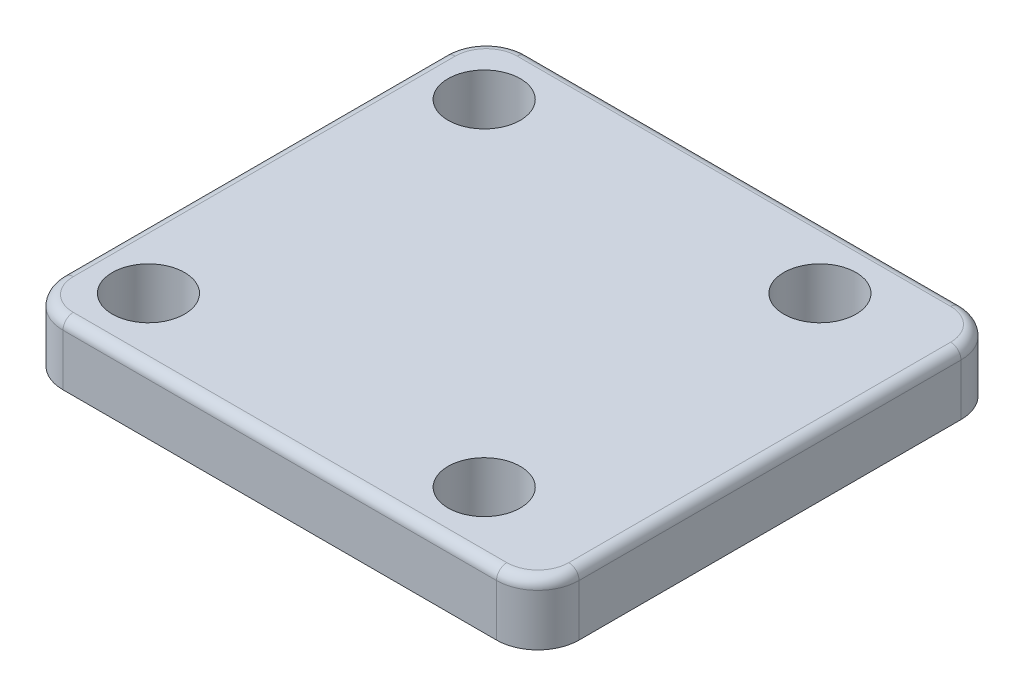
ISO-10303-21;
HEADER;
FILE_DESCRIPTION(('STEP AP214'),'2;1');
FILE_NAME('part.step','',(''),(''),'','','');
FILE_SCHEMA(('AUTOMOTIVE_DESIGN { 1 0 10303 214 1 1 1 1 }'));
ENDSEC;
DATA;
#1=APPLICATION_CONTEXT('core data for automotive mechanical design processes');
#2=APPLICATION_PROTOCOL_DEFINITION('international standard','automotive_design',2000,#1);
#3=PRODUCT_CONTEXT('',#1,'mechanical');
#4=PRODUCT('Part','Part','',(#3));
#5=PRODUCT_RELATED_PRODUCT_CATEGORY('part','',(#4));
#6=PRODUCT_DEFINITION_FORMATION('','',#4);
#7=PRODUCT_DEFINITION_CONTEXT('part definition',#1,'design');
#8=PRODUCT_DEFINITION('design','',#6,#7);
#9=PRODUCT_DEFINITION_SHAPE('','',#8);
#10=(LENGTH_UNIT() NAMED_UNIT(*) SI_UNIT(.MILLI.,.METRE.));
#11=(NAMED_UNIT(*) PLANE_ANGLE_UNIT() SI_UNIT($,.RADIAN.));
#12=(NAMED_UNIT(*) SI_UNIT($,.STERADIAN.) SOLID_ANGLE_UNIT());
#13=UNCERTAINTY_MEASURE_WITH_UNIT(LENGTH_MEASURE(1.E-05),#10,'distance_accuracy_value','');
#14=(GEOMETRIC_REPRESENTATION_CONTEXT(3) GLOBAL_UNCERTAINTY_ASSIGNED_CONTEXT((#13)) GLOBAL_UNIT_ASSIGNED_CONTEXT((#10,
#11,#12)) REPRESENTATION_CONTEXT('',''));
#15=CARTESIAN_POINT('',(0.,0.,0.));
#16=DIRECTION('',(0.,0.,1.));
#17=DIRECTION('',(1.,0.,0.));
#18=AXIS2_PLACEMENT_3D('',#15,#16,#17);
#19=CARTESIAN_POINT('',(23.6943462897526,6.,-18.5));
#20=DIRECTION('',(0.,-1.,0.));
#21=DIRECTION('',(0.,0.,-1.));
#22=AXIS2_PLACEMENT_3D('',#19,#20,#21);
#23=CYLINDRICAL_SURFACE('',#22,4.);
#24=DIRECTION('',(0.,-1.,0.));
#25=VECTOR('',#24,1.);
#26=CARTESIAN_POINT('',(23.6943462897526,6.,-22.5));
#27=LINE('',#26,#25);
#28=CARTESIAN_POINT('',(23.6943462897526,5.,-22.5));
#29=VERTEX_POINT('',#28);
#30=CARTESIAN_POINT('',(23.6943462897526,0.,-22.5));
#31=VERTEX_POINT('',#30);
#32=EDGE_CURVE('E138',#29,#31,#27,.T.);
#33=ORIENTED_EDGE('',*,*,#32,.F.);
#34=CARTESIAN_POINT('',(23.6943462897526,5.,-18.5));
#35=DIRECTION('',(0.,-1.,0.));
#36=DIRECTION('',(0.,0.,-1.));
#37=AXIS2_PLACEMENT_3D('',#34,#35,#36);
#38=CIRCLE('',#37,4.);
#39=CARTESIAN_POINT('',(27.6943462897526,5.,-18.5));
#40=VERTEX_POINT('',#39);
#41=EDGE_CURVE('E226',#29,#40,#38,.T.);
#42=ORIENTED_EDGE('',*,*,#41,.T.);
#43=DIRECTION('',(0.,-1.,0.));
#44=VECTOR('',#43,1.);
#45=CARTESIAN_POINT('',(27.6943462897526,6.,-18.5));
#46=LINE('',#45,#44);
#47=CARTESIAN_POINT('',(27.6943462897526,0.,-18.5));
#48=VERTEX_POINT('',#47);
#49=EDGE_CURVE('E159',#40,#48,#46,.T.);
#50=ORIENTED_EDGE('',*,*,#49,.T.);
#51=CARTESIAN_POINT('',(23.6943462897526,0.,-18.5));
#52=DIRECTION('',(0.,1.,0.));
#53=DIRECTION('',(0.,0.,-1.));
#54=AXIS2_PLACEMENT_3D('',#51,#52,#53);
#55=CIRCLE('',#54,4.);
#56=EDGE_CURVE('E153',#48,#31,#55,.T.);
#57=ORIENTED_EDGE('',*,*,#56,.T.);
#58=EDGE_LOOP('',(#33,#42,#50,#57));
#59=FACE_BOUND('',#58,.T.);
#60=ADVANCED_FACE('F47',(#59),#23,.T.);
#61=CARTESIAN_POINT('',(-18.3056537102473,6.,-22.5));
#62=DIRECTION('',(0.,0.,1.));
#63=DIRECTION('',(1.,0.,0.));
#64=AXIS2_PLACEMENT_3D('',#61,#62,#63);
#65=PLANE('',#64);
#66=DIRECTION('',(0.,-1.,0.));
#67=VECTOR('',#66,1.);
#68=CARTESIAN_POINT('',(-18.3056537102473,6.,-22.5));
#69=LINE('',#68,#67);
#70=CARTESIAN_POINT('',(-18.3056537102473,5.,-22.5));
#71=VERTEX_POINT('',#70);
#72=CARTESIAN_POINT('',(-18.3056537102473,0.,-22.5));
#73=VERTEX_POINT('',#72);
#74=EDGE_CURVE('E147',#71,#73,#69,.T.);
#75=ORIENTED_EDGE('',*,*,#74,.F.);
#76=DIRECTION('',(-1.,0.,0.));
#77=VECTOR('',#76,1.);
#78=CARTESIAN_POINT('',(-18.3056537102473,5.,-22.5));
#79=LINE('',#78,#77);
#80=EDGE_CURVE('E65',#71,#29,#79,.F.);
#81=ORIENTED_EDGE('',*,*,#80,.T.);
#82=ORIENTED_EDGE('',*,*,#32,.T.);
#83=DIRECTION('',(-1.,0.,0.));
#84=VECTOR('',#83,1.);
#85=CARTESIAN_POINT('',(-18.3056537102473,0.,-22.5));
#86=LINE('',#85,#84);
#87=EDGE_CURVE('E141',#31,#73,#86,.T.);
#88=ORIENTED_EDGE('',*,*,#87,.T.);
#89=EDGE_LOOP('',(#75,#81,#82,#88));
#90=FACE_BOUND('',#89,.T.);
#91=ADVANCED_FACE('F140',(#90),#65,.F.);
#92=CARTESIAN_POINT('',(-18.3056537102474,6.,-18.5));
#93=DIRECTION('',(0.,-1.,0.));
#94=DIRECTION('',(0.,0.,-1.));
#95=AXIS2_PLACEMENT_3D('',#92,#93,#94);
#96=CYLINDRICAL_SURFACE('',#95,4.);
#97=DIRECTION('',(0.,-1.,0.));
#98=VECTOR('',#97,1.);
#99=CARTESIAN_POINT('',(-22.3056537102474,6.,-18.5));
#100=LINE('',#99,#98);
#101=CARTESIAN_POINT('',(-22.3056537102474,5.,-18.5));
#102=VERTEX_POINT('',#101);
#103=CARTESIAN_POINT('',(-22.3056537102474,0.,-18.5));
#104=VERTEX_POINT('',#103);
#105=EDGE_CURVE('E194',#102,#104,#100,.T.);
#106=ORIENTED_EDGE('',*,*,#105,.F.);
#107=CARTESIAN_POINT('',(-18.3056537102474,5.,-18.5));
#108=DIRECTION('',(0.,-1.,0.));
#109=DIRECTION('',(0.,0.,-1.));
#110=AXIS2_PLACEMENT_3D('',#107,#108,#109);
#111=CIRCLE('',#110,4.);
#112=EDGE_CURVE('E73',#102,#71,#111,.T.);
#113=ORIENTED_EDGE('',*,*,#112,.T.);
#114=ORIENTED_EDGE('',*,*,#74,.T.);
#115=CARTESIAN_POINT('',(-18.3056537102474,0.,-18.5));
#116=DIRECTION('',(0.,1.,0.));
#117=DIRECTION('',(0.,0.,1.));
#118=AXIS2_PLACEMENT_3D('',#115,#116,#117);
#119=CIRCLE('',#118,4.);
#120=EDGE_CURVE('E156',#73,#104,#119,.T.);
#121=ORIENTED_EDGE('',*,*,#120,.T.);
#122=EDGE_LOOP('',(#106,#113,#114,#121));
#123=FACE_BOUND('',#122,.T.);
#124=ADVANCED_FACE('F298',(#123),#96,.T.);
#125=CARTESIAN_POINT('',(-22.3056537102474,6.,-18.5));
#126=DIRECTION('',(1.,0.,0.));
#127=DIRECTION('',(0.,0.,-1.));
#128=AXIS2_PLACEMENT_3D('',#125,#126,#127);
#129=PLANE('',#128);
#130=DIRECTION('',(0.,-1.,0.));
#131=VECTOR('',#130,1.);
#132=CARTESIAN_POINT('',(-22.3056537102474,6.,18.5));
#133=LINE('',#132,#131);
#134=CARTESIAN_POINT('',(-22.3056537102474,5.,18.5));
#135=VERTEX_POINT('',#134);
#136=CARTESIAN_POINT('',(-22.3056537102474,0.,18.5));
#137=VERTEX_POINT('',#136);
#138=EDGE_CURVE('E192',#135,#137,#133,.T.);
#139=ORIENTED_EDGE('',*,*,#138,.F.);
#140=DIRECTION('',(0.,0.,1.));
#141=VECTOR('',#140,1.);
#142=CARTESIAN_POINT('',(-22.3056537102474,5.,-18.5));
#143=LINE('',#142,#141);
#144=EDGE_CURVE('E222',#135,#102,#143,.F.);
#145=ORIENTED_EDGE('',*,*,#144,.T.);
#146=ORIENTED_EDGE('',*,*,#105,.T.);
#147=DIRECTION('',(0.,0.,1.));
#148=VECTOR('',#147,1.);
#149=CARTESIAN_POINT('',(-22.3056537102474,0.,-18.5));
#150=LINE('',#149,#148);
#151=EDGE_CURVE('E171',#104,#137,#150,.T.);
#152=ORIENTED_EDGE('',*,*,#151,.T.);
#153=EDGE_LOOP('',(#139,#145,#146,#152));
#154=FACE_BOUND('',#153,.T.);
#155=ADVANCED_FACE('F364',(#154),#129,.F.);
#156=CARTESIAN_POINT('',(-18.3056537102474,6.,18.5));
#157=DIRECTION('',(0.,-1.,0.));
#158=DIRECTION('',(0.,0.,-1.));
#159=AXIS2_PLACEMENT_3D('',#156,#157,#158);
#160=CYLINDRICAL_SURFACE('',#159,4.);
#161=DIRECTION('',(0.,-1.,0.));
#162=VECTOR('',#161,1.);
#163=CARTESIAN_POINT('',(-18.3056537102474,6.,22.5));
#164=LINE('',#163,#162);
#165=CARTESIAN_POINT('',(-18.3056537102474,5.,22.5));
#166=VERTEX_POINT('',#165);
#167=CARTESIAN_POINT('',(-18.3056537102474,0.,22.5));
#168=VERTEX_POINT('',#167);
#169=EDGE_CURVE('E190',#166,#168,#164,.T.);
#170=ORIENTED_EDGE('',*,*,#169,.F.);
#171=CARTESIAN_POINT('',(-18.3056537102474,5.,18.5));
#172=DIRECTION('',(0.,-1.,0.));
#173=DIRECTION('',(0.,0.,-1.));
#174=AXIS2_PLACEMENT_3D('',#171,#172,#173);
#175=CIRCLE('',#174,4.);
#176=EDGE_CURVE('E220',#166,#135,#175,.T.);
#177=ORIENTED_EDGE('',*,*,#176,.T.);
#178=ORIENTED_EDGE('',*,*,#138,.T.);
#179=CARTESIAN_POINT('',(-18.3056537102474,0.,18.5));
#180=DIRECTION('',(0.,1.,0.));
#181=DIRECTION('',(0.,0.,1.));
#182=AXIS2_PLACEMENT_3D('',#179,#180,#181);
#183=CIRCLE('',#182,4.);
#184=EDGE_CURVE('E174',#137,#168,#183,.T.);
#185=ORIENTED_EDGE('',*,*,#184,.T.);
#186=EDGE_LOOP('',(#170,#177,#178,#185));
#187=FACE_BOUND('',#186,.T.);
#188=ADVANCED_FACE('F362',(#187),#160,.T.);
#189=CARTESIAN_POINT('',(-18.3056537102473,6.,22.5));
#190=DIRECTION('',(0.,0.,-1.));
#191=DIRECTION('',(-1.,0.,0.));
#192=AXIS2_PLACEMENT_3D('',#189,#190,#191);
#193=PLANE('',#192);
#194=DIRECTION('',(0.,-1.,0.));
#195=VECTOR('',#194,1.);
#196=CARTESIAN_POINT('',(23.6943462897526,6.,22.5));
#197=LINE('',#196,#195);
#198=CARTESIAN_POINT('',(23.6943462897526,5.,22.5));
#199=VERTEX_POINT('',#198);
#200=CARTESIAN_POINT('',(23.6943462897526,0.,22.5));
#201=VERTEX_POINT('',#200);
#202=EDGE_CURVE('E188',#199,#201,#197,.T.);
#203=ORIENTED_EDGE('',*,*,#202,.F.);
#204=DIRECTION('',(1.,0.,0.));
#205=VECTOR('',#204,1.);
#206=CARTESIAN_POINT('',(-18.3056537102473,5.,22.5));
#207=LINE('',#206,#205);
#208=EDGE_CURVE('E218',#199,#166,#207,.F.);
#209=ORIENTED_EDGE('',*,*,#208,.T.);
#210=ORIENTED_EDGE('',*,*,#169,.T.);
#211=DIRECTION('',(1.,0.,0.));
#212=VECTOR('',#211,1.);
#213=CARTESIAN_POINT('',(-18.3056537102473,0.,22.5));
#214=LINE('',#213,#212);
#215=EDGE_CURVE('E177',#168,#201,#214,.T.);
#216=ORIENTED_EDGE('',*,*,#215,.T.);
#217=EDGE_LOOP('',(#203,#209,#210,#216));
#218=FACE_BOUND('',#217,.T.);
#219=ADVANCED_FACE('F352',(#218),#193,.F.);
#220=CARTESIAN_POINT('',(23.6943462897526,6.,18.5));
#221=DIRECTION('',(0.,-1.,0.));
#222=DIRECTION('',(0.,0.,-1.));
#223=AXIS2_PLACEMENT_3D('',#220,#221,#222);
#224=CYLINDRICAL_SURFACE('',#223,4.);
#225=DIRECTION('',(0.,-1.,0.));
#226=VECTOR('',#225,1.);
#227=CARTESIAN_POINT('',(27.6943462897526,6.,18.5));
#228=LINE('',#227,#226);
#229=CARTESIAN_POINT('',(27.6943462897526,5.,18.5));
#230=VERTEX_POINT('',#229);
#231=CARTESIAN_POINT('',(27.6943462897526,0.,18.5));
#232=VERTEX_POINT('',#231);
#233=EDGE_CURVE('E186',#230,#232,#228,.T.);
#234=ORIENTED_EDGE('',*,*,#233,.F.);
#235=CARTESIAN_POINT('',(23.6943462897526,5.,18.5));
#236=DIRECTION('',(0.,-1.,0.));
#237=DIRECTION('',(0.,0.,-1.));
#238=AXIS2_PLACEMENT_3D('',#235,#236,#237);
#239=CIRCLE('',#238,4.);
#240=EDGE_CURVE('E216',#230,#199,#239,.T.);
#241=ORIENTED_EDGE('',*,*,#240,.T.);
#242=ORIENTED_EDGE('',*,*,#202,.T.);
#243=CARTESIAN_POINT('',(23.6943462897526,0.,18.5));
#244=DIRECTION('',(0.,1.,0.));
#245=DIRECTION('',(0.,0.,1.));
#246=AXIS2_PLACEMENT_3D('',#243,#244,#245);
#247=CIRCLE('',#246,4.);
#248=EDGE_CURVE('E180',#201,#232,#247,.T.);
#249=ORIENTED_EDGE('',*,*,#248,.T.);
#250=EDGE_LOOP('',(#234,#241,#242,#249));
#251=FACE_BOUND('',#250,.T.);
#252=ADVANCED_FACE('F349',(#251),#224,.T.);
#253=CARTESIAN_POINT('',(27.6943462897526,6.,-18.5));
#254=DIRECTION('',(-1.,0.,0.));
#255=DIRECTION('',(0.,0.,1.));
#256=AXIS2_PLACEMENT_3D('',#253,#254,#255);
#257=PLANE('',#256);
#258=ORIENTED_EDGE('',*,*,#49,.F.);
#259=DIRECTION('',(0.,0.,-1.));
#260=VECTOR('',#259,1.);
#261=CARTESIAN_POINT('',(27.6943462897526,5.,-18.5));
#262=LINE('',#261,#260);
#263=EDGE_CURVE('E213',#40,#230,#262,.F.);
#264=ORIENTED_EDGE('',*,*,#263,.T.);
#265=ORIENTED_EDGE('',*,*,#233,.T.);
#266=DIRECTION('',(0.,0.,-1.));
#267=VECTOR('',#266,1.);
#268=CARTESIAN_POINT('',(27.6943462897526,0.,-18.5));
#269=LINE('',#268,#267);
#270=EDGE_CURVE('E183',#232,#48,#269,.T.);
#271=ORIENTED_EDGE('',*,*,#270,.T.);
#272=EDGE_LOOP('',(#258,#264,#265,#271));
#273=FACE_BOUND('',#272,.T.);
#274=ADVANCED_FACE('F340',(#273),#257,.F.);
#275=CARTESIAN_POINT('',(23.6943462897526,6.,-18.5));
#276=DIRECTION('',(0.,-1.,0.));
#277=DIRECTION('',(0.,0.,-1.));
#278=AXIS2_PLACEMENT_3D('',#275,#276,#277);
#279=PLANE('',#278);
#280=CARTESIAN_POINT('',(-16.2634559672902,6.,16.2634559672906));
#281=DIRECTION('',(0.,1.,0.));
#282=DIRECTION('',(0.,0.,1.));
#283=AXIS2_PLACEMENT_3D('',#280,#281,#282);
#284=CIRCLE('',#283,3.50000000000035);
#285=CARTESIAN_POINT('',(-16.2634559672902,6.,19.7634559672909));
#286=VERTEX_POINT('',#285);
#287=EDGE_CURVE('E386',#286,#286,#284,.T.);
#288=ORIENTED_EDGE('',*,*,#287,.F.);
#289=EDGE_LOOP('',(#288));
#290=FACE_BOUND('',#289,.T.);
#291=CARTESIAN_POINT('',(16.263455967291,6.,16.2634559672902));
#292=DIRECTION('',(0.,1.,0.));
#293=DIRECTION('',(0.,0.,1.));
#294=AXIS2_PLACEMENT_3D('',#291,#292,#293);
#295=CIRCLE('',#294,3.50000000000071);
#296=CARTESIAN_POINT('',(16.263455967291,6.,19.7634559672909));
#297=VERTEX_POINT('',#296);
#298=EDGE_CURVE('E390',#297,#297,#295,.T.);
#299=ORIENTED_EDGE('',*,*,#298,.F.);
#300=EDGE_LOOP('',(#299));
#301=FACE_BOUND('',#300,.T.);
#302=CARTESIAN_POINT('',(16.2634559672907,6.,-16.2634559672905));
#303=DIRECTION('',(0.,1.,0.));
#304=DIRECTION('',(0.,0.,1.));
#305=AXIS2_PLACEMENT_3D('',#302,#303,#304);
#306=CIRCLE('',#305,3.5);
#307=CARTESIAN_POINT('',(16.2634559672907,6.,-12.7634559672905));
#308=VERTEX_POINT('',#307);
#309=EDGE_CURVE('E394',#308,#308,#306,.T.);
#310=ORIENTED_EDGE('',*,*,#309,.F.);
#311=EDGE_LOOP('',(#310));
#312=FACE_BOUND('',#311,.T.);
#313=CARTESIAN_POINT('',(-16.2634559672906,6.,-16.2634559672906));
#314=DIRECTION('',(0.,1.,0.));
#315=DIRECTION('',(0.,0.,1.));
#316=AXIS2_PLACEMENT_3D('',#313,#314,#315);
#317=CIRCLE('',#316,3.5);
#318=CARTESIAN_POINT('',(-16.2634559672906,6.,-12.7634559672906));
#319=VERTEX_POINT('',#318);
#320=EDGE_CURVE('E252',#319,#319,#317,.T.);
#321=ORIENTED_EDGE('',*,*,#320,.F.);
#322=EDGE_LOOP('',(#321));
#323=FACE_BOUND('',#322,.T.);
#324=CARTESIAN_POINT('',(23.6943462897526,6.,18.5));
#325=DIRECTION('',(0.,-1.,0.));
#326=DIRECTION('',(0.,0.,-1.));
#327=AXIS2_PLACEMENT_3D('',#324,#325,#326);
#328=CIRCLE('',#327,3.);
#329=CARTESIAN_POINT('',(23.6943462897526,6.,21.5));
#330=VERTEX_POINT('',#329);
#331=CARTESIAN_POINT('',(26.6943462897526,6.,18.5));
#332=VERTEX_POINT('',#331);
#333=EDGE_CURVE('E208',#330,#332,#328,.F.);
#334=ORIENTED_EDGE('',*,*,#333,.T.);
#335=DIRECTION('',(0.,0.,-1.));
#336=VECTOR('',#335,1.);
#337=CARTESIAN_POINT('',(26.6943462897526,6.,-18.5));
#338=LINE('',#337,#336);
#339=CARTESIAN_POINT('',(26.6943462897526,6.,-18.5));
#340=VERTEX_POINT('',#339);
#341=EDGE_CURVE('E210',#332,#340,#338,.T.);
#342=ORIENTED_EDGE('',*,*,#341,.T.);
#343=CARTESIAN_POINT('',(23.6943462897526,6.,-18.5));
#344=DIRECTION('',(0.,-1.,0.));
#345=DIRECTION('',(0.,0.,-1.));
#346=AXIS2_PLACEMENT_3D('',#343,#344,#345);
#347=CIRCLE('',#346,3.);
#348=CARTESIAN_POINT('',(23.6943462897526,6.,-21.5));
#349=VERTEX_POINT('',#348);
#350=EDGE_CURVE('E146',#340,#349,#347,.F.);
#351=ORIENTED_EDGE('',*,*,#350,.T.);
#352=DIRECTION('',(-1.,0.,0.));
#353=VECTOR('',#352,1.);
#354=CARTESIAN_POINT('',(23.6943462897526,6.,-21.5));
#355=LINE('',#354,#353);
#356=CARTESIAN_POINT('',(-18.3056537102473,6.,-21.5));
#357=VERTEX_POINT('',#356);
#358=EDGE_CURVE('E198',#349,#357,#355,.T.);
#359=ORIENTED_EDGE('',*,*,#358,.T.);
#360=CARTESIAN_POINT('',(-18.3056537102474,6.,-18.5));
#361=DIRECTION('',(0.,-1.,0.));
#362=DIRECTION('',(0.,0.,-1.));
#363=AXIS2_PLACEMENT_3D('',#360,#361,#362);
#364=CIRCLE('',#363,3.);
#365=CARTESIAN_POINT('',(-21.3056537102474,6.,-18.5));
#366=VERTEX_POINT('',#365);
#367=EDGE_CURVE('E200',#357,#366,#364,.F.);
#368=ORIENTED_EDGE('',*,*,#367,.T.);
#369=DIRECTION('',(0.,0.,1.));
#370=VECTOR('',#369,1.);
#371=CARTESIAN_POINT('',(-21.3056537102474,6.,-18.5));
#372=LINE('',#371,#370);
#373=CARTESIAN_POINT('',(-21.3056537102474,6.,18.5));
#374=VERTEX_POINT('',#373);
#375=EDGE_CURVE('E202',#366,#374,#372,.T.);
#376=ORIENTED_EDGE('',*,*,#375,.T.);
#377=CARTESIAN_POINT('',(-18.3056537102474,6.,18.5));
#378=DIRECTION('',(0.,-1.,0.));
#379=DIRECTION('',(0.,0.,-1.));
#380=AXIS2_PLACEMENT_3D('',#377,#378,#379);
#381=CIRCLE('',#380,3.);
#382=CARTESIAN_POINT('',(-18.3056537102474,6.,21.5));
#383=VERTEX_POINT('',#382);
#384=EDGE_CURVE('E204',#374,#383,#381,.F.);
#385=ORIENTED_EDGE('',*,*,#384,.T.);
#386=DIRECTION('',(1.,0.,0.));
#387=VECTOR('',#386,1.);
#388=CARTESIAN_POINT('',(23.6943462897526,6.,21.5));
#389=LINE('',#388,#387);
#390=EDGE_CURVE('E206',#383,#330,#389,.T.);
#391=ORIENTED_EDGE('',*,*,#390,.T.);
#392=EDGE_LOOP('',(#334,#342,#351,#359,#368,#376,#385,#391));
#393=FACE_BOUND('',#392,.T.);
#394=ADVANCED_FACE('F267',(#290,#301,#312,#323,#393),#279,.F.);
#395=CARTESIAN_POINT('',(23.6943462897526,0.,-18.5));
#396=DIRECTION('',(0.,-1.,0.));
#397=DIRECTION('',(0.,0.,-1.));
#398=AXIS2_PLACEMENT_3D('',#395,#396,#397);
#399=PLANE('',#398);
#400=CARTESIAN_POINT('',(-16.2634559672902,0.,16.2634559672906));
#401=DIRECTION('',(0.,-1.,0.));
#402=DIRECTION('',(0.,0.,-1.));
#403=AXIS2_PLACEMENT_3D('',#400,#401,#402);
#404=CIRCLE('',#403,3.50000000000035);
#405=CARTESIAN_POINT('',(-16.2634559672902,0.,12.7634559672902));
#406=VERTEX_POINT('',#405);
#407=EDGE_CURVE('E52',#406,#406,#404,.T.);
#408=ORIENTED_EDGE('',*,*,#407,.F.);
#409=EDGE_LOOP('',(#408));
#410=FACE_BOUND('',#409,.T.);
#411=CARTESIAN_POINT('',(16.263455967291,0.,16.2634559672902));
#412=DIRECTION('',(0.,-1.,0.));
#413=DIRECTION('',(0.,0.,-1.));
#414=AXIS2_PLACEMENT_3D('',#411,#412,#413);
#415=CIRCLE('',#414,3.50000000000071);
#416=CARTESIAN_POINT('',(16.263455967291,0.,12.7634559672895));
#417=VERTEX_POINT('',#416);
#418=EDGE_CURVE('E254',#417,#417,#415,.T.);
#419=ORIENTED_EDGE('',*,*,#418,.F.);
#420=EDGE_LOOP('',(#419));
#421=FACE_BOUND('',#420,.T.);
#422=CARTESIAN_POINT('',(16.2634559672907,0.,-16.2634559672905));
#423=DIRECTION('',(0.,-1.,0.));
#424=DIRECTION('',(0.,0.,-1.));
#425=AXIS2_PLACEMENT_3D('',#422,#423,#424);
#426=CIRCLE('',#425,3.5);
#427=CARTESIAN_POINT('',(16.2634559672907,0.,-19.7634559672905));
#428=VERTEX_POINT('',#427);
#429=EDGE_CURVE('E251',#428,#428,#426,.T.);
#430=ORIENTED_EDGE('',*,*,#429,.F.);
#431=EDGE_LOOP('',(#430));
#432=FACE_BOUND('',#431,.T.);
#433=CARTESIAN_POINT('',(-16.2634559672906,0.,-16.2634559672906));
#434=DIRECTION('',(0.,-1.,0.));
#435=DIRECTION('',(0.,0.,-1.));
#436=AXIS2_PLACEMENT_3D('',#433,#434,#435);
#437=CIRCLE('',#436,3.5);
#438=CARTESIAN_POINT('',(-16.2634559672906,0.,-19.7634559672906));
#439=VERTEX_POINT('',#438);
#440=EDGE_CURVE('E248',#439,#439,#437,.T.);
#441=ORIENTED_EDGE('',*,*,#440,.F.);
#442=EDGE_LOOP('',(#441));
#443=FACE_BOUND('',#442,.T.);
#444=CARTESIAN_POINT('',(0.,0.,0.));
#445=DIRECTION('',(0.,-1.,0.));
#446=DIRECTION('',(0.,0.,-1.));
#447=AXIS2_PLACEMENT_3D('',#444,#445,#446);
#448=CIRCLE('',#447,16.);
#449=CARTESIAN_POINT('',(0.,0.,-16.));
#450=VERTEX_POINT('',#449);
#451=EDGE_CURVE('E167',#450,#450,#448,.T.);
#452=ORIENTED_EDGE('',*,*,#451,.F.);
#453=EDGE_LOOP('',(#452));
#454=FACE_BOUND('',#453,.T.);
#455=ORIENTED_EDGE('',*,*,#56,.F.);
#456=ORIENTED_EDGE('',*,*,#270,.F.);
#457=ORIENTED_EDGE('',*,*,#248,.F.);
#458=ORIENTED_EDGE('',*,*,#215,.F.);
#459=ORIENTED_EDGE('',*,*,#184,.F.);
#460=ORIENTED_EDGE('',*,*,#151,.F.);
#461=ORIENTED_EDGE('',*,*,#120,.F.);
#462=ORIENTED_EDGE('',*,*,#87,.F.);
#463=EDGE_LOOP('',(#455,#456,#457,#458,#459,#460,#461,#462));
#464=FACE_BOUND('',#463,.T.);
#465=ADVANCED_FACE('F151',(#410,#421,#432,#443,#454,#464),#399,.T.);
#466=CARTESIAN_POINT('',(-21.3056537102474,5.,-18.5));
#467=DIRECTION('',(0.,0.,1.));
#468=DIRECTION('',(1.,0.,0.));
#469=AXIS2_PLACEMENT_3D('',#466,#467,#468);
#470=CYLINDRICAL_SURFACE('',#469,1.);
#471=CARTESIAN_POINT('',(-21.3056537102474,5.,-18.5));
#472=DIRECTION('',(0.,0.,-1.));
#473=DIRECTION('',(-1.,0.,0.));
#474=AXIS2_PLACEMENT_3D('',#471,#472,#473);
#475=CIRCLE('',#474,1.);
#476=EDGE_CURVE('E164',#102,#366,#475,.T.);
#477=ORIENTED_EDGE('',*,*,#476,.F.);
#478=ORIENTED_EDGE('',*,*,#144,.F.);
#479=CARTESIAN_POINT('',(-21.3056537102474,5.,18.5));
#480=DIRECTION('',(0.,0.,1.));
#481=DIRECTION('',(1.,0.,0.));
#482=AXIS2_PLACEMENT_3D('',#479,#480,#481);
#483=CIRCLE('',#482,1.);
#484=EDGE_CURVE('E161',#374,#135,#483,.T.);
#485=ORIENTED_EDGE('',*,*,#484,.F.);
#486=ORIENTED_EDGE('',*,*,#375,.F.);
#487=EDGE_LOOP('',(#477,#478,#485,#486));
#488=FACE_BOUND('',#487,.T.);
#489=ADVANCED_FACE('F266',(#488),#470,.T.);
#490=CARTESIAN_POINT('',(-18.3056537102474,5.,18.5));
#491=DIRECTION('',(0.,-1.,0.));
#492=DIRECTION('',(0.,0.,-1.));
#493=AXIS2_PLACEMENT_3D('',#490,#491,#492);
#494=TOROIDAL_SURFACE('',#493,3.,1.);
#495=ORIENTED_EDGE('',*,*,#484,.T.);
#496=ORIENTED_EDGE('',*,*,#176,.F.);
#497=CARTESIAN_POINT('',(-18.3056537102474,5.,21.5));
#498=DIRECTION('',(1.,0.,0.));
#499=DIRECTION('',(0.,0.,-1.));
#500=AXIS2_PLACEMENT_3D('',#497,#498,#499);
#501=CIRCLE('',#500,1.);
#502=EDGE_CURVE('E241',#383,#166,#501,.T.);
#503=ORIENTED_EDGE('',*,*,#502,.F.);
#504=ORIENTED_EDGE('',*,*,#384,.F.);
#505=EDGE_LOOP('',(#495,#496,#503,#504));
#506=FACE_BOUND('',#505,.T.);
#507=ADVANCED_FACE('F320',(#506),#494,.T.);
#508=CARTESIAN_POINT('',(-18.3056537102474,5.,-18.5));
#509=DIRECTION('',(0.,-1.,0.));
#510=DIRECTION('',(0.,0.,-1.));
#511=AXIS2_PLACEMENT_3D('',#508,#509,#510);
#512=TOROIDAL_SURFACE('',#511,3.,1.);
#513=ORIENTED_EDGE('',*,*,#476,.T.);
#514=ORIENTED_EDGE('',*,*,#367,.F.);
#515=CARTESIAN_POINT('',(-18.3056537102473,5.,-21.5));
#516=DIRECTION('',(1.,0.,0.));
#517=DIRECTION('',(0.,0.,-1.));
#518=AXIS2_PLACEMENT_3D('',#515,#516,#517);
#519=CIRCLE('',#518,1.);
#520=EDGE_CURVE('E238',#71,#357,#519,.T.);
#521=ORIENTED_EDGE('',*,*,#520,.F.);
#522=ORIENTED_EDGE('',*,*,#112,.F.);
#523=EDGE_LOOP('',(#513,#514,#521,#522));
#524=FACE_BOUND('',#523,.T.);
#525=ADVANCED_FACE('F316',(#524),#512,.T.);
#526=CARTESIAN_POINT('',(23.6943462897526,5.,21.5));
#527=DIRECTION('',(1.,0.,0.));
#528=DIRECTION('',(0.,0.,-1.));
#529=AXIS2_PLACEMENT_3D('',#526,#527,#528);
#530=CYLINDRICAL_SURFACE('',#529,1.);
#531=ORIENTED_EDGE('',*,*,#502,.T.);
#532=ORIENTED_EDGE('',*,*,#208,.F.);
#533=CARTESIAN_POINT('',(23.6943462897526,5.,21.5));
#534=DIRECTION('',(1.,0.,0.));
#535=DIRECTION('',(0.,0.,-1.));
#536=AXIS2_PLACEMENT_3D('',#533,#534,#535);
#537=CIRCLE('',#536,1.);
#538=EDGE_CURVE('E235',#330,#199,#537,.T.);
#539=ORIENTED_EDGE('',*,*,#538,.F.);
#540=ORIENTED_EDGE('',*,*,#390,.F.);
#541=EDGE_LOOP('',(#531,#532,#539,#540));
#542=FACE_BOUND('',#541,.T.);
#543=ADVANCED_FACE('F312',(#542),#530,.T.);
#544=CARTESIAN_POINT('',(23.6943462897526,5.,-21.5));
#545=DIRECTION('',(-1.,0.,0.));
#546=DIRECTION('',(0.,0.,1.));
#547=AXIS2_PLACEMENT_3D('',#544,#545,#546);
#548=CYLINDRICAL_SURFACE('',#547,1.);
#549=ORIENTED_EDGE('',*,*,#520,.T.);
#550=ORIENTED_EDGE('',*,*,#358,.F.);
#551=CARTESIAN_POINT('',(23.6943462897526,5.,-21.5));
#552=DIRECTION('',(1.,0.,0.));
#553=DIRECTION('',(0.,0.,-1.));
#554=AXIS2_PLACEMENT_3D('',#551,#552,#553);
#555=CIRCLE('',#554,1.);
#556=EDGE_CURVE('E232',#29,#349,#555,.T.);
#557=ORIENTED_EDGE('',*,*,#556,.F.);
#558=ORIENTED_EDGE('',*,*,#80,.F.);
#559=EDGE_LOOP('',(#549,#550,#557,#558));
#560=FACE_BOUND('',#559,.T.);
#561=ADVANCED_FACE('F308',(#560),#548,.T.);
#562=CARTESIAN_POINT('',(23.6943462897526,5.,18.5));
#563=DIRECTION('',(0.,-1.,0.));
#564=DIRECTION('',(0.,0.,-1.));
#565=AXIS2_PLACEMENT_3D('',#562,#563,#564);
#566=TOROIDAL_SURFACE('',#565,3.,1.);
#567=ORIENTED_EDGE('',*,*,#538,.T.);
#568=ORIENTED_EDGE('',*,*,#240,.F.);
#569=CARTESIAN_POINT('',(26.6943462897526,5.,18.5));
#570=DIRECTION('',(0.,0.,-1.));
#571=DIRECTION('',(-1.,0.,0.));
#572=AXIS2_PLACEMENT_3D('',#569,#570,#571);
#573=CIRCLE('',#572,1.);
#574=EDGE_CURVE('E230',#332,#230,#573,.T.);
#575=ORIENTED_EDGE('',*,*,#574,.F.);
#576=ORIENTED_EDGE('',*,*,#333,.F.);
#577=EDGE_LOOP('',(#567,#568,#575,#576));
#578=FACE_BOUND('',#577,.T.);
#579=ADVANCED_FACE('F304',(#578),#566,.T.);
#580=CARTESIAN_POINT('',(23.6943462897526,5.,-18.5));
#581=DIRECTION('',(0.,-1.,0.));
#582=DIRECTION('',(0.,0.,-1.));
#583=AXIS2_PLACEMENT_3D('',#580,#581,#582);
#584=TOROIDAL_SURFACE('',#583,3.,1.);
#585=ORIENTED_EDGE('',*,*,#556,.T.);
#586=ORIENTED_EDGE('',*,*,#350,.F.);
#587=CARTESIAN_POINT('',(26.6943462897526,5.,-18.5));
#588=DIRECTION('',(0.,0.,1.));
#589=DIRECTION('',(0.,-1.,0.));
#590=AXIS2_PLACEMENT_3D('',#587,#588,#589);
#591=CIRCLE('',#590,1.);
#592=EDGE_CURVE('E228',#40,#340,#591,.T.);
#593=ORIENTED_EDGE('',*,*,#592,.F.);
#594=ORIENTED_EDGE('',*,*,#41,.F.);
#595=EDGE_LOOP('',(#585,#586,#593,#594));
#596=FACE_BOUND('',#595,.T.);
#597=ADVANCED_FACE('F289',(#596),#584,.T.);
#598=CARTESIAN_POINT('',(26.6943462897526,5.,-18.5));
#599=DIRECTION('',(0.,0.,-1.));
#600=DIRECTION('',(-1.,0.,0.));
#601=AXIS2_PLACEMENT_3D('',#598,#599,#600);
#602=CYLINDRICAL_SURFACE('',#601,1.);
#603=ORIENTED_EDGE('',*,*,#574,.T.);
#604=ORIENTED_EDGE('',*,*,#263,.F.);
#605=ORIENTED_EDGE('',*,*,#592,.T.);
#606=ORIENTED_EDGE('',*,*,#341,.F.);
#607=EDGE_LOOP('',(#603,#604,#605,#606));
#608=FACE_BOUND('',#607,.T.);
#609=ADVANCED_FACE('F280',(#608),#602,.T.);
#610=CARTESIAN_POINT('',(0.,-2.,0.));
#611=DIRECTION('',(0.,1.,0.));
#612=DIRECTION('',(0.,0.,1.));
#613=AXIS2_PLACEMENT_3D('',#610,#611,#612);
#614=CYLINDRICAL_SURFACE('',#613,16.);
#615=CARTESIAN_POINT('',(0.,-0.999999999999999,0.));
#616=DIRECTION('',(0.,-1.,0.));
#617=DIRECTION('',(0.,0.,-1.));
#618=AXIS2_PLACEMENT_3D('',#615,#616,#617);
#619=CIRCLE('',#618,16.);
#620=CARTESIAN_POINT('',(0.,-0.999999999999999,-16.));
#621=VERTEX_POINT('',#620);
#622=EDGE_CURVE('E11',#621,#621,#619,.F.);
#623=ORIENTED_EDGE('',*,*,#622,.T.);
#624=EDGE_LOOP('',(#623));
#625=FACE_BOUND('',#624,.T.);
#626=ORIENTED_EDGE('',*,*,#451,.T.);
#627=EDGE_LOOP('',(#626));
#628=FACE_BOUND('',#627,.T.);
#629=ADVANCED_FACE('F277',(#625,#628),#614,.T.);
#630=CARTESIAN_POINT('',(0.,-2.,0.));
#631=DIRECTION('',(0.,-1.,0.));
#632=DIRECTION('',(0.,0.,-1.));
#633=AXIS2_PLACEMENT_3D('',#630,#631,#632);
#634=PLANE('',#633);
#635=CARTESIAN_POINT('',(0.,-2.,0.));
#636=DIRECTION('',(0.,-1.,0.));
#637=DIRECTION('',(0.,0.,-1.));
#638=AXIS2_PLACEMENT_3D('',#635,#636,#637);
#639=CIRCLE('',#638,15.);
#640=CARTESIAN_POINT('',(0.,-2.,-15.));
#641=VERTEX_POINT('',#640);
#642=EDGE_CURVE('E57',#641,#641,#639,.T.);
#643=ORIENTED_EDGE('',*,*,#642,.T.);
#644=EDGE_LOOP('',(#643));
#645=FACE_BOUND('',#644,.T.);
#646=ADVANCED_FACE('F279',(#645),#634,.T.);
#647=CARTESIAN_POINT('',(0.,-2.,0.));
#648=DIRECTION('',(0.,1.,0.));
#649=DIRECTION('',(0.,0.,1.));
#650=AXIS2_PLACEMENT_3D('',#647,#648,#649);
#651=CONICAL_SURFACE('',#650,15.,0.785398163397448);
#652=ORIENTED_EDGE('',*,*,#622,.F.);
#653=EDGE_LOOP('',(#652));
#654=FACE_BOUND('',#653,.T.);
#655=ORIENTED_EDGE('',*,*,#642,.F.);
#656=EDGE_LOOP('',(#655));
#657=FACE_BOUND('',#656,.T.);
#658=ADVANCED_FACE('F50',(#654,#657),#651,.T.);
#659=CARTESIAN_POINT('',(-16.2634559672906,-2.,-16.2634559672906));
#660=DIRECTION('',(0.,1.,0.));
#661=DIRECTION('',(0.,0.,1.));
#662=AXIS2_PLACEMENT_3D('',#659,#660,#661);
#663=CYLINDRICAL_SURFACE('',#662,3.5);
#664=ORIENTED_EDGE('',*,*,#440,.T.);
#665=EDGE_LOOP('',(#664));
#666=FACE_BOUND('',#665,.T.);
#667=ORIENTED_EDGE('',*,*,#320,.T.);
#668=EDGE_LOOP('',(#667));
#669=FACE_BOUND('',#668,.T.);
#670=ADVANCED_FACE('F412',(#666,#669),#663,.F.);
#671=CARTESIAN_POINT('',(16.2634559672907,-2.,-16.2634559672905));
#672=DIRECTION('',(0.,1.,0.));
#673=DIRECTION('',(0.,0.,1.));
#674=AXIS2_PLACEMENT_3D('',#671,#672,#673);
#675=CYLINDRICAL_SURFACE('',#674,3.5);
#676=ORIENTED_EDGE('',*,*,#429,.T.);
#677=EDGE_LOOP('',(#676));
#678=FACE_BOUND('',#677,.T.);
#679=ORIENTED_EDGE('',*,*,#309,.T.);
#680=EDGE_LOOP('',(#679));
#681=FACE_BOUND('',#680,.T.);
#682=ADVANCED_FACE('F405',(#678,#681),#675,.F.);
#683=CARTESIAN_POINT('',(16.263455967291,-2.,16.2634559672902));
#684=DIRECTION('',(0.,1.,0.));
#685=DIRECTION('',(0.,0.,1.));
#686=AXIS2_PLACEMENT_3D('',#683,#684,#685);
#687=CYLINDRICAL_SURFACE('',#686,3.50000000000071);
#688=ORIENTED_EDGE('',*,*,#418,.T.);
#689=EDGE_LOOP('',(#688));
#690=FACE_BOUND('',#689,.T.);
#691=ORIENTED_EDGE('',*,*,#298,.T.);
#692=EDGE_LOOP('',(#691));
#693=FACE_BOUND('',#692,.T.);
#694=ADVANCED_FACE('F403',(#690,#693),#687,.F.);
#695=CARTESIAN_POINT('',(-16.2634559672902,-2.,16.2634559672906));
#696=DIRECTION('',(0.,1.,0.));
#697=DIRECTION('',(0.,0.,1.));
#698=AXIS2_PLACEMENT_3D('',#695,#696,#697);
#699=CYLINDRICAL_SURFACE('',#698,3.50000000000035);
#700=ORIENTED_EDGE('',*,*,#407,.T.);
#701=EDGE_LOOP('',(#700));
#702=FACE_BOUND('',#701,.T.);
#703=ORIENTED_EDGE('',*,*,#287,.T.);
#704=EDGE_LOOP('',(#703));
#705=FACE_BOUND('',#704,.T.);
#706=ADVANCED_FACE('F261',(#702,#705),#699,.F.);
#707=CLOSED_SHELL('',(#60,#91,#124,#155,#188,#219,#252,#274,#394,#465,#489,#507,#525,#543,#561,
#579,#597,#609,#629,#646,#658,#670,#682,#694,#706));
#708=MANIFOLD_SOLID_BREP('B2',#707);
#709=ADVANCED_BREP_SHAPE_REPRESENTATION('',(#18,#708),#14);
#710=SHAPE_DEFINITION_REPRESENTATION(#9,#709);
ENDSEC;
END-ISO-10303-21;
